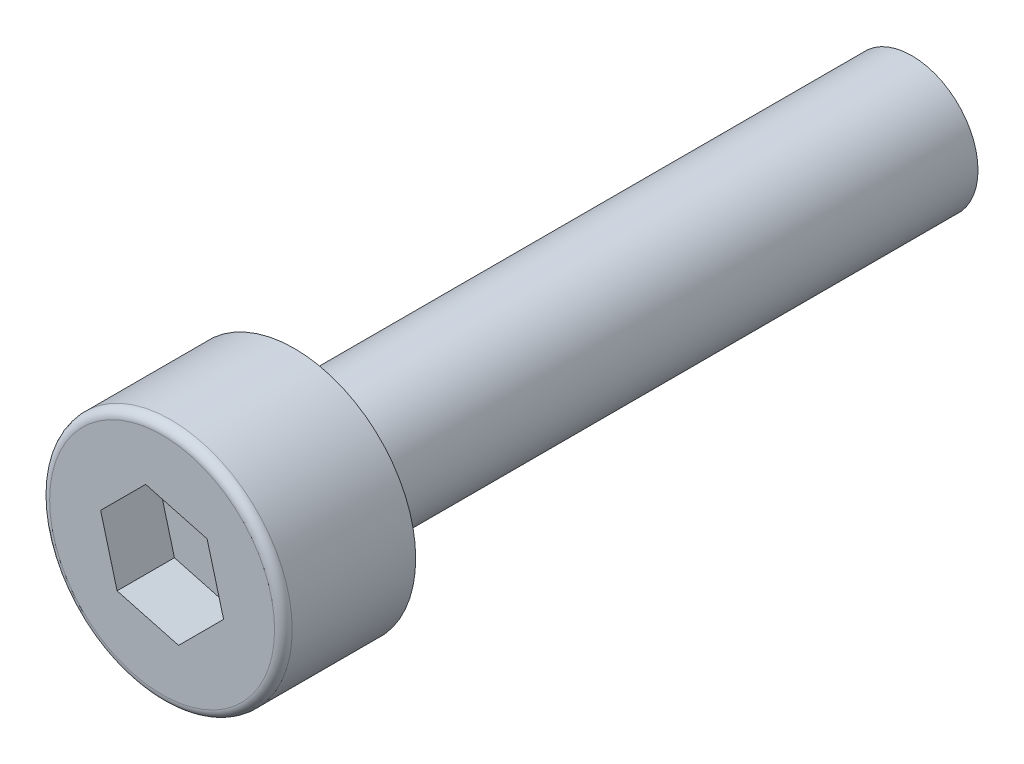
ISO-10303-21;
HEADER;
FILE_DESCRIPTION(('STEP AP214'),'2;1');
FILE_NAME('part.step','',(''),(''),'','','');
FILE_SCHEMA(('AUTOMOTIVE_DESIGN { 1 0 10303 214 1 1 1 1 }'));
ENDSEC;
DATA;
#1=APPLICATION_CONTEXT('core data for automotive mechanical design processes');
#2=APPLICATION_PROTOCOL_DEFINITION('international standard','automotive_design',2000,#1);
#3=PRODUCT_CONTEXT('',#1,'mechanical');
#4=PRODUCT('Part','Part','',(#3));
#5=PRODUCT_RELATED_PRODUCT_CATEGORY('part','',(#4));
#6=PRODUCT_DEFINITION_FORMATION('','',#4);
#7=PRODUCT_DEFINITION_CONTEXT('part definition',#1,'design');
#8=PRODUCT_DEFINITION('design','',#6,#7);
#9=PRODUCT_DEFINITION_SHAPE('','',#8);
#10=(LENGTH_UNIT() NAMED_UNIT(*) SI_UNIT(.MILLI.,.METRE.));
#11=(NAMED_UNIT(*) PLANE_ANGLE_UNIT() SI_UNIT($,.RADIAN.));
#12=(NAMED_UNIT(*) SI_UNIT($,.STERADIAN.) SOLID_ANGLE_UNIT());
#13=UNCERTAINTY_MEASURE_WITH_UNIT(LENGTH_MEASURE(1.E-05),#10,'distance_accuracy_value','');
#14=(GEOMETRIC_REPRESENTATION_CONTEXT(3) GLOBAL_UNCERTAINTY_ASSIGNED_CONTEXT((#13)) GLOBAL_UNIT_ASSIGNED_CONTEXT((#10,
#11,#12)) REPRESENTATION_CONTEXT('',''));
#15=CARTESIAN_POINT('',(0.,0.,0.));
#16=DIRECTION('',(0.,0.,1.));
#17=DIRECTION('',(1.,0.,0.));
#18=AXIS2_PLACEMENT_3D('',#15,#16,#17);
#19=CARTESIAN_POINT('',(0.,0.,0.));
#20=DIRECTION('',(0.,0.,1.));
#21=DIRECTION('',(1.,0.,0.));
#22=AXIS2_PLACEMENT_3D('',#19,#20,#21);
#23=PLANE('',#22);
#24=CARTESIAN_POINT('',(0.,0.,0.));
#25=DIRECTION('',(0.,0.,1.));
#26=DIRECTION('',(1.,0.,0.));
#27=AXIS2_PLACEMENT_3D('',#24,#25,#26);
#28=CIRCLE('',#27,2.75);
#29=CARTESIAN_POINT('',(2.75,0.,0.));
#30=VERTEX_POINT('',#29);
#31=EDGE_CURVE('E139',#30,#30,#28,.T.);
#32=ORIENTED_EDGE('',*,*,#31,.F.);
#33=EDGE_LOOP('',(#32));
#34=FACE_BOUND('',#33,.T.);
#35=CARTESIAN_POINT('',(0.,0.,0.));
#36=DIRECTION('',(0.,0.,1.));
#37=DIRECTION('',(1.,0.,0.));
#38=AXIS2_PLACEMENT_3D('',#35,#36,#37);
#39=CIRCLE('',#38,1.5);
#40=CARTESIAN_POINT('',(1.5,0.,0.));
#41=VERTEX_POINT('',#40);
#42=EDGE_CURVE('E147',#41,#41,#39,.F.);
#43=ORIENTED_EDGE('',*,*,#42,.F.);
#44=EDGE_LOOP('',(#43));
#45=FACE_BOUND('',#44,.T.);
#46=ADVANCED_FACE('F36',(#34,#45),#23,.F.);
#47=CARTESIAN_POINT('',(0.,0.,3.));
#48=DIRECTION('',(0.,0.,-1.));
#49=DIRECTION('',(-1.,0.,0.));
#50=AXIS2_PLACEMENT_3D('',#47,#48,#49);
#51=CYLINDRICAL_SURFACE('',#50,2.75);
#52=CARTESIAN_POINT('',(0.,0.,2.8));
#53=DIRECTION('',(0.,0.,1.));
#54=DIRECTION('',(1.,0.,0.));
#55=AXIS2_PLACEMENT_3D('',#52,#53,#54);
#56=CIRCLE('',#55,2.75);
#57=CARTESIAN_POINT('',(2.75,0.,2.8));
#58=VERTEX_POINT('',#57);
#59=EDGE_CURVE('E11',#58,#58,#56,.F.);
#60=ORIENTED_EDGE('',*,*,#59,.T.);
#61=EDGE_LOOP('',(#60));
#62=FACE_BOUND('',#61,.T.);
#63=ORIENTED_EDGE('',*,*,#31,.T.);
#64=EDGE_LOOP('',(#63));
#65=FACE_BOUND('',#64,.T.);
#66=ADVANCED_FACE('F166',(#62,#65),#51,.T.);
#67=CARTESIAN_POINT('',(0.,0.,3.));
#68=DIRECTION('',(0.,0.,1.));
#69=DIRECTION('',(1.,0.,0.));
#70=AXIS2_PLACEMENT_3D('',#67,#68,#69);
#71=PLANE('',#70);
#72=CARTESIAN_POINT('',(0.,0.,3.));
#73=DIRECTION('',(0.,0.,1.));
#74=DIRECTION('',(1.,0.,0.));
#75=AXIS2_PLACEMENT_3D('',#72,#73,#74);
#76=CIRCLE('',#75,2.55);
#77=CARTESIAN_POINT('',(2.55,0.,3.));
#78=VERTEX_POINT('',#77);
#79=EDGE_CURVE('E44',#78,#78,#76,.T.);
#80=ORIENTED_EDGE('',*,*,#79,.T.);
#81=EDGE_LOOP('',(#80));
#82=FACE_BOUND('',#81,.T.);
#83=DIRECTION('',(0.258819045102521,-0.965925826289068,0.));
#84=VECTOR('',#83,1.);
#85=CARTESIAN_POINT('',(-1.39419383956301,0.373573113403356,3.));
#86=LINE('',#85,#84);
#87=CARTESIAN_POINT('',(-1.39419383956301,0.373573113403356,3.));
#88=VERTEX_POINT('',#87);
#89=CARTESIAN_POINT('',(-1.02062072615966,-1.02062072615966,3.));
#90=VERTEX_POINT('',#89);
#91=EDGE_CURVE('E51',#88,#90,#86,.T.);
#92=ORIENTED_EDGE('',*,*,#91,.F.);
#93=DIRECTION('',(-0.707106781186548,-0.707106781186548,0.));
#94=VECTOR('',#93,1.);
#95=CARTESIAN_POINT('',(-0.373573113403355,1.39419383956301,3.));
#96=LINE('',#95,#94);
#97=CARTESIAN_POINT('',(-0.373573113403355,1.39419383956301,3.));
#98=VERTEX_POINT('',#97);
#99=EDGE_CURVE('E135',#98,#88,#96,.T.);
#100=ORIENTED_EDGE('',*,*,#99,.F.);
#101=DIRECTION('',(-0.965925826289068,0.258819045102521,0.));
#102=VECTOR('',#101,1.);
#103=CARTESIAN_POINT('',(1.02062072615966,1.02062072615966,3.));
#104=LINE('',#103,#102);
#105=CARTESIAN_POINT('',(1.02062072615966,1.02062072615966,3.));
#106=VERTEX_POINT('',#105);
#107=EDGE_CURVE('E133',#106,#98,#104,.T.);
#108=ORIENTED_EDGE('',*,*,#107,.F.);
#109=DIRECTION('',(-0.258819045102521,0.965925826289068,0.));
#110=VECTOR('',#109,1.);
#111=CARTESIAN_POINT('',(1.39419383956301,-0.373573113403355,3.));
#112=LINE('',#111,#110);
#113=CARTESIAN_POINT('',(1.39419383956301,-0.373573113403355,3.));
#114=VERTEX_POINT('',#113);
#115=EDGE_CURVE('E99',#114,#106,#112,.T.);
#116=ORIENTED_EDGE('',*,*,#115,.F.);
#117=DIRECTION('',(0.707106781186548,0.707106781186548,0.));
#118=VECTOR('',#117,1.);
#119=CARTESIAN_POINT('',(0.373573113403355,-1.39419383956301,3.));
#120=LINE('',#119,#118);
#121=CARTESIAN_POINT('',(0.373573113403355,-1.39419383956301,3.));
#122=VERTEX_POINT('',#121);
#123=EDGE_CURVE('E129',#122,#114,#120,.T.);
#124=ORIENTED_EDGE('',*,*,#123,.F.);
#125=DIRECTION('',(0.965925826289068,-0.258819045102521,0.));
#126=VECTOR('',#125,1.);
#127=CARTESIAN_POINT('',(-1.02062072615966,-1.02062072615966,3.));
#128=LINE('',#127,#126);
#129=EDGE_CURVE('E125',#90,#122,#128,.T.);
#130=ORIENTED_EDGE('',*,*,#129,.F.);
#131=EDGE_LOOP('',(#92,#100,#108,#116,#124,#130));
#132=FACE_BOUND('',#131,.T.);
#133=ADVANCED_FACE('F152',(#82,#132),#71,.T.);
#134=CARTESIAN_POINT('',(-1.39419383956301,0.373573113403356,1.7));
#135=DIRECTION('',(-0.965925826289068,-0.258819045102521,0.));
#136=DIRECTION('',(0.258819045102521,-0.965925826289068,0.));
#137=AXIS2_PLACEMENT_3D('',#134,#135,#136);
#138=PLANE('',#137);
#139=ORIENTED_EDGE('',*,*,#91,.T.);
#140=DIRECTION('',(0.,0.,1.));
#141=VECTOR('',#140,1.);
#142=CARTESIAN_POINT('',(-1.02062072615966,-1.02062072615966,1.7));
#143=LINE('',#142,#141);
#144=CARTESIAN_POINT('',(-1.02062072615966,-1.02062072615966,1.7));
#145=VERTEX_POINT('',#144);
#146=EDGE_CURVE('E81',#145,#90,#143,.T.);
#147=ORIENTED_EDGE('',*,*,#146,.F.);
#148=DIRECTION('',(0.258819045102521,-0.965925826289068,0.));
#149=VECTOR('',#148,1.);
#150=CARTESIAN_POINT('',(-1.39419383956301,0.373573113403356,1.7));
#151=LINE('',#150,#149);
#152=CARTESIAN_POINT('',(-1.39419383956301,0.373573113403356,1.7));
#153=VERTEX_POINT('',#152);
#154=EDGE_CURVE('E137',#153,#145,#151,.T.);
#155=ORIENTED_EDGE('',*,*,#154,.F.);
#156=DIRECTION('',(0.,0.,1.));
#157=VECTOR('',#156,1.);
#158=CARTESIAN_POINT('',(-1.39419383956301,0.373573113403356,1.7));
#159=LINE('',#158,#157);
#160=EDGE_CURVE('E59',#153,#88,#159,.T.);
#161=ORIENTED_EDGE('',*,*,#160,.T.);
#162=EDGE_LOOP('',(#139,#147,#155,#161));
#163=FACE_BOUND('',#162,.T.);
#164=ADVANCED_FACE('F178',(#163),#138,.F.);
#165=CARTESIAN_POINT('',(-0.373573113403355,1.39419383956301,1.7));
#166=DIRECTION('',(-0.707106781186548,0.707106781186548,0.));
#167=DIRECTION('',(-0.707106781186548,-0.707106781186548,0.));
#168=AXIS2_PLACEMENT_3D('',#165,#166,#167);
#169=PLANE('',#168);
#170=ORIENTED_EDGE('',*,*,#99,.T.);
#171=ORIENTED_EDGE('',*,*,#160,.F.);
#172=DIRECTION('',(-0.707106781186548,-0.707106781186548,0.));
#173=VECTOR('',#172,1.);
#174=CARTESIAN_POINT('',(-0.373573113403355,1.39419383956301,1.7));
#175=LINE('',#174,#173);
#176=CARTESIAN_POINT('',(-0.373573113403355,1.39419383956301,1.7));
#177=VERTEX_POINT('',#176);
#178=EDGE_CURVE('E111',#177,#153,#175,.T.);
#179=ORIENTED_EDGE('',*,*,#178,.F.);
#180=DIRECTION('',(0.,0.,1.));
#181=VECTOR('',#180,1.);
#182=CARTESIAN_POINT('',(-0.373573113403355,1.39419383956301,1.7));
#183=LINE('',#182,#181);
#184=EDGE_CURVE('E103',#177,#98,#183,.T.);
#185=ORIENTED_EDGE('',*,*,#184,.T.);
#186=EDGE_LOOP('',(#170,#171,#179,#185));
#187=FACE_BOUND('',#186,.T.);
#188=ADVANCED_FACE('F181',(#187),#169,.F.);
#189=CARTESIAN_POINT('',(1.02062072615966,1.02062072615966,1.7));
#190=DIRECTION('',(0.258819045102521,0.965925826289068,0.));
#191=DIRECTION('',(-0.965925826289068,0.258819045102521,0.));
#192=AXIS2_PLACEMENT_3D('',#189,#190,#191);
#193=PLANE('',#192);
#194=ORIENTED_EDGE('',*,*,#107,.T.);
#195=ORIENTED_EDGE('',*,*,#184,.F.);
#196=DIRECTION('',(-0.965925826289068,0.258819045102521,0.));
#197=VECTOR('',#196,1.);
#198=CARTESIAN_POINT('',(1.02062072615966,1.02062072615966,1.7));
#199=LINE('',#198,#197);
#200=CARTESIAN_POINT('',(1.02062072615966,1.02062072615966,1.7));
#201=VERTEX_POINT('',#200);
#202=EDGE_CURVE('E107',#201,#177,#199,.T.);
#203=ORIENTED_EDGE('',*,*,#202,.F.);
#204=DIRECTION('',(0.,0.,1.));
#205=VECTOR('',#204,1.);
#206=CARTESIAN_POINT('',(1.02062072615966,1.02062072615966,1.7));
#207=LINE('',#206,#205);
#208=EDGE_CURVE('E92',#201,#106,#207,.T.);
#209=ORIENTED_EDGE('',*,*,#208,.T.);
#210=EDGE_LOOP('',(#194,#195,#203,#209));
#211=FACE_BOUND('',#210,.T.);
#212=ADVANCED_FACE('F108',(#211),#193,.F.);
#213=CARTESIAN_POINT('',(1.39419383956301,-0.373573113403355,1.7));
#214=DIRECTION('',(0.965925826289068,0.258819045102521,0.));
#215=DIRECTION('',(-0.258819045102521,0.965925826289068,0.));
#216=AXIS2_PLACEMENT_3D('',#213,#214,#215);
#217=PLANE('',#216);
#218=ORIENTED_EDGE('',*,*,#115,.T.);
#219=ORIENTED_EDGE('',*,*,#208,.F.);
#220=DIRECTION('',(-0.258819045102521,0.965925826289068,0.));
#221=VECTOR('',#220,1.);
#222=CARTESIAN_POINT('',(1.39419383956301,-0.373573113403355,1.7));
#223=LINE('',#222,#221);
#224=CARTESIAN_POINT('',(1.39419383956301,-0.373573113403355,1.7));
#225=VERTEX_POINT('',#224);
#226=EDGE_CURVE('E96',#225,#201,#223,.T.);
#227=ORIENTED_EDGE('',*,*,#226,.F.);
#228=DIRECTION('',(0.,0.,1.));
#229=VECTOR('',#228,1.);
#230=CARTESIAN_POINT('',(1.39419383956301,-0.373573113403355,1.7));
#231=LINE('',#230,#229);
#232=EDGE_CURVE('E104',#225,#114,#231,.T.);
#233=ORIENTED_EDGE('',*,*,#232,.T.);
#234=EDGE_LOOP('',(#218,#219,#227,#233));
#235=FACE_BOUND('',#234,.T.);
#236=ADVANCED_FACE('F94',(#235),#217,.F.);
#237=CARTESIAN_POINT('',(0.373573113403355,-1.39419383956301,1.7));
#238=DIRECTION('',(0.707106781186548,-0.707106781186548,0.));
#239=DIRECTION('',(0.707106781186548,0.707106781186548,0.));
#240=AXIS2_PLACEMENT_3D('',#237,#238,#239);
#241=PLANE('',#240);
#242=ORIENTED_EDGE('',*,*,#123,.T.);
#243=ORIENTED_EDGE('',*,*,#232,.F.);
#244=DIRECTION('',(0.707106781186548,0.707106781186548,0.));
#245=VECTOR('',#244,1.);
#246=CARTESIAN_POINT('',(0.373573113403355,-1.39419383956301,1.7));
#247=LINE('',#246,#245);
#248=CARTESIAN_POINT('',(0.373573113403355,-1.39419383956301,1.7));
#249=VERTEX_POINT('',#248);
#250=EDGE_CURVE('E117',#249,#225,#247,.T.);
#251=ORIENTED_EDGE('',*,*,#250,.F.);
#252=DIRECTION('',(0.,0.,1.));
#253=VECTOR('',#252,1.);
#254=CARTESIAN_POINT('',(0.373573113403355,-1.39419383956301,1.7));
#255=LINE('',#254,#253);
#256=EDGE_CURVE('E142',#249,#122,#255,.T.);
#257=ORIENTED_EDGE('',*,*,#256,.T.);
#258=EDGE_LOOP('',(#242,#243,#251,#257));
#259=FACE_BOUND('',#258,.T.);
#260=ADVANCED_FACE('F185',(#259),#241,.F.);
#261=CARTESIAN_POINT('',(-1.02062072615966,-1.02062072615966,1.7));
#262=DIRECTION('',(-0.258819045102521,-0.965925826289068,0.));
#263=DIRECTION('',(0.965925826289068,-0.258819045102521,0.));
#264=AXIS2_PLACEMENT_3D('',#261,#262,#263);
#265=PLANE('',#264);
#266=ORIENTED_EDGE('',*,*,#129,.T.);
#267=ORIENTED_EDGE('',*,*,#256,.F.);
#268=DIRECTION('',(0.965925826289068,-0.258819045102521,0.));
#269=VECTOR('',#268,1.);
#270=CARTESIAN_POINT('',(-1.02062072615966,-1.02062072615966,1.7));
#271=LINE('',#270,#269);
#272=EDGE_CURVE('E119',#145,#249,#271,.T.);
#273=ORIENTED_EDGE('',*,*,#272,.F.);
#274=ORIENTED_EDGE('',*,*,#146,.T.);
#275=EDGE_LOOP('',(#266,#267,#273,#274));
#276=FACE_BOUND('',#275,.T.);
#277=ADVANCED_FACE('F182',(#276),#265,.F.);
#278=CARTESIAN_POINT('',(0.,0.,1.7));
#279=DIRECTION('',(0.,0.,1.));
#280=DIRECTION('',(1.,0.,0.));
#281=AXIS2_PLACEMENT_3D('',#278,#279,#280);
#282=PLANE('',#281);
#283=ORIENTED_EDGE('',*,*,#154,.T.);
#284=ORIENTED_EDGE('',*,*,#272,.T.);
#285=ORIENTED_EDGE('',*,*,#250,.T.);
#286=ORIENTED_EDGE('',*,*,#226,.T.);
#287=ORIENTED_EDGE('',*,*,#202,.T.);
#288=ORIENTED_EDGE('',*,*,#178,.T.);
#289=EDGE_LOOP('',(#283,#284,#285,#286,#287,#288));
#290=FACE_BOUND('',#289,.T.);
#291=ADVANCED_FACE('F114',(#290),#282,.T.);
#292=CARTESIAN_POINT('',(0.,0.,-14.));
#293=DIRECTION('',(0.,0.,1.));
#294=DIRECTION('',(1.,0.,0.));
#295=AXIS2_PLACEMENT_3D('',#292,#293,#294);
#296=CYLINDRICAL_SURFACE('',#295,1.5);
#297=CARTESIAN_POINT('',(0.,0.,-14.));
#298=DIRECTION('',(0.,0.,-1.));
#299=DIRECTION('',(-1.,0.,0.));
#300=AXIS2_PLACEMENT_3D('',#297,#298,#299);
#301=CIRCLE('',#300,1.5);
#302=CARTESIAN_POINT('',(-1.5,0.,-14.));
#303=VERTEX_POINT('',#302);
#304=EDGE_CURVE('E126',#303,#303,#301,.T.);
#305=ORIENTED_EDGE('',*,*,#304,.F.);
#306=EDGE_LOOP('',(#305));
#307=FACE_BOUND('',#306,.T.);
#308=ORIENTED_EDGE('',*,*,#42,.T.);
#309=EDGE_LOOP('',(#308));
#310=FACE_BOUND('',#309,.T.);
#311=ADVANCED_FACE('F161',(#307,#310),#296,.T.);
#312=CARTESIAN_POINT('',(0.,0.,-14.));
#313=DIRECTION('',(0.,0.,-1.));
#314=DIRECTION('',(-1.,0.,0.));
#315=AXIS2_PLACEMENT_3D('',#312,#313,#314);
#316=PLANE('',#315);
#317=ORIENTED_EDGE('',*,*,#304,.T.);
#318=EDGE_LOOP('',(#317));
#319=FACE_BOUND('',#318,.T.);
#320=ADVANCED_FACE('F156',(#319),#316,.T.);
#321=CARTESIAN_POINT('',(0.,0.,2.8));
#322=DIRECTION('',(0.,0.,1.));
#323=DIRECTION('',(1.,0.,0.));
#324=AXIS2_PLACEMENT_3D('',#321,#322,#323);
#325=TOROIDAL_SURFACE('',#324,2.55,0.2);
#326=ORIENTED_EDGE('',*,*,#59,.F.);
#327=EDGE_LOOP('',(#326));
#328=FACE_BOUND('',#327,.T.);
#329=ORIENTED_EDGE('',*,*,#79,.F.);
#330=EDGE_LOOP('',(#329));
#331=FACE_BOUND('',#330,.T.);
#332=ADVANCED_FACE('F38',(#328,#331),#325,.T.);
#333=CLOSED_SHELL('',(#46,#66,#133,#164,#188,#212,#236,#260,#277,#291,#311,#320,#332));
#334=MANIFOLD_SOLID_BREP('B2',#333);
#335=ADVANCED_BREP_SHAPE_REPRESENTATION('',(#18,#334),#14);
#336=SHAPE_DEFINITION_REPRESENTATION(#9,#335);
ENDSEC;
END-ISO-10303-21;
